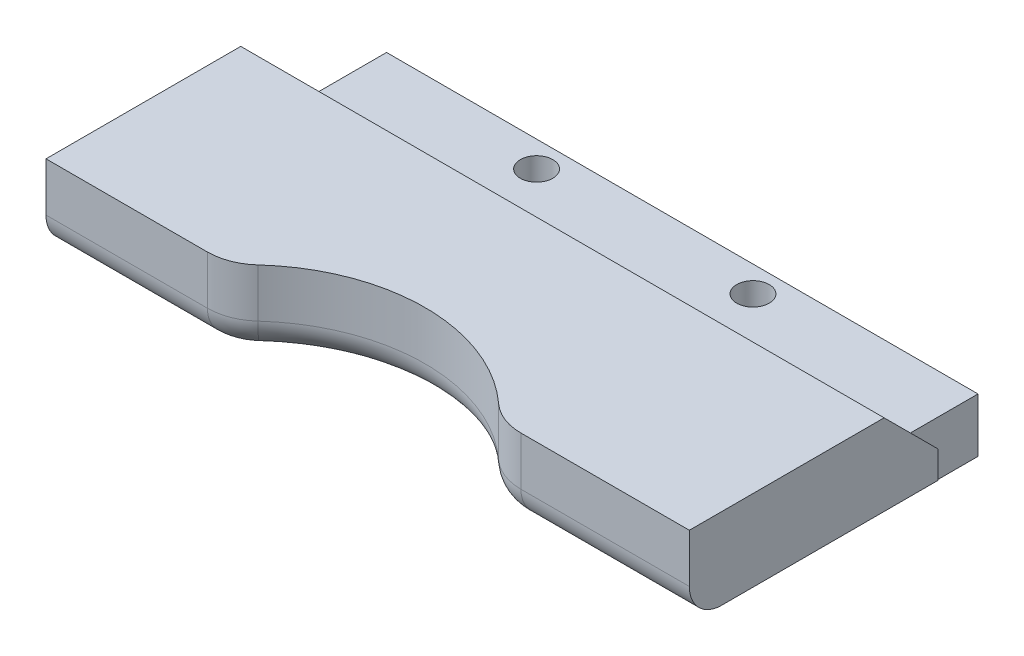
ISO-10303-21;
HEADER;
FILE_DESCRIPTION(('STEP AP214'),'2;1');
FILE_NAME('part.step','',(''),(''),'','','');
FILE_SCHEMA(('AUTOMOTIVE_DESIGN { 1 0 10303 214 1 1 1 1 }'));
ENDSEC;
DATA;
#1=APPLICATION_CONTEXT('core data for automotive mechanical design processes');
#2=APPLICATION_PROTOCOL_DEFINITION('international standard','automotive_design',2000,#1);
#3=PRODUCT_CONTEXT('',#1,'mechanical');
#4=PRODUCT('Part','Part','',(#3));
#5=PRODUCT_RELATED_PRODUCT_CATEGORY('part','',(#4));
#6=PRODUCT_DEFINITION_FORMATION('','',#4);
#7=PRODUCT_DEFINITION_CONTEXT('part definition',#1,'design');
#8=PRODUCT_DEFINITION('design','',#6,#7);
#9=PRODUCT_DEFINITION_SHAPE('','',#8);
#10=(LENGTH_UNIT() NAMED_UNIT(*) SI_UNIT(.MILLI.,.METRE.));
#11=(NAMED_UNIT(*) PLANE_ANGLE_UNIT() SI_UNIT($,.RADIAN.));
#12=(NAMED_UNIT(*) SI_UNIT($,.STERADIAN.) SOLID_ANGLE_UNIT());
#13=UNCERTAINTY_MEASURE_WITH_UNIT(LENGTH_MEASURE(1.E-05),#10,'distance_accuracy_value','');
#14=(GEOMETRIC_REPRESENTATION_CONTEXT(3) GLOBAL_UNCERTAINTY_ASSIGNED_CONTEXT((#13)) GLOBAL_UNIT_ASSIGNED_CONTEXT((#10,
#11,#12)) REPRESENTATION_CONTEXT('',''));
#15=CARTESIAN_POINT('',(0.,0.,0.));
#16=DIRECTION('',(0.,0.,1.));
#17=DIRECTION('',(1.,0.,0.));
#18=AXIS2_PLACEMENT_3D('',#15,#16,#17);
#19=CARTESIAN_POINT('',(0.,0.,11.11));
#20=DIRECTION('',(0.,0.,1.));
#21=DIRECTION('',(1.,0.,0.));
#22=AXIS2_PLACEMENT_3D('',#19,#20,#21);
#23=PLANE('',#22);
#24=DIRECTION('',(0.,-1.,0.));
#25=VECTOR('',#24,1.);
#26=CARTESIAN_POINT('',(-29.7300965377152,3.750174262941,11.11));
#27=LINE('',#26,#25);
#28=CARTESIAN_POINT('',(-29.7300965377152,3.75017426294096,11.11));
#29=VERTEX_POINT('',#28);
#30=CARTESIAN_POINT('',(-29.7300965377152,1.24982573705901,11.11));
#31=VERTEX_POINT('',#30);
#32=EDGE_CURVE('E241',#29,#31,#27,.T.);
#33=ORIENTED_EDGE('',*,*,#32,.F.);
#34=DIRECTION('',(1.,0.,0.));
#35=VECTOR('',#34,1.);
#36=CARTESIAN_POINT('',(29.7300965377152,3.75017426294096,11.11));
#37=LINE('',#36,#35);
#38=CARTESIAN_POINT('',(-26.2566275867251,3.75017426294096,11.11));
#39=VERTEX_POINT('',#38);
#40=EDGE_CURVE('E295',#29,#39,#37,.T.);
#41=ORIENTED_EDGE('',*,*,#40,.T.);
#42=DIRECTION('',(0.,-1.,0.));
#43=VECTOR('',#42,1.);
#44=CARTESIAN_POINT('',(-26.2566275867251,5.,11.11));
#45=LINE('',#44,#43);
#46=CARTESIAN_POINT('',(-26.2566275867251,1.24982573705901,11.11));
#47=VERTEX_POINT('',#46);
#48=EDGE_CURVE('E271',#39,#47,#45,.T.);
#49=ORIENTED_EDGE('',*,*,#48,.T.);
#50=DIRECTION('',(1.,0.,0.));
#51=VECTOR('',#50,1.);
#52=CARTESIAN_POINT('',(-29.7300965377152,1.24982573705901,11.11));
#53=LINE('',#52,#51);
#54=EDGE_CURVE('E237',#31,#47,#53,.T.);
#55=ORIENTED_EDGE('',*,*,#54,.F.);
#56=EDGE_LOOP('',(#33,#41,#49,#55));
#57=FACE_BOUND('',#56,.T.);
#58=ADVANCED_FACE('F72',(#57),#23,.F.);
#59=CARTESIAN_POINT('',(0.,0.,34.11));
#60=DIRECTION('',(0.,0.,1.));
#61=DIRECTION('',(1.,0.,0.));
#62=AXIS2_PLACEMENT_3D('',#59,#60,#61);
#63=PLANE('',#62);
#64=DIRECTION('',(0.,-1.,0.));
#65=VECTOR('',#64,1.);
#66=CARTESIAN_POINT('',(14.1694647091156,1.24982573705901,34.11));
#67=LINE('',#66,#65);
#68=CARTESIAN_POINT('',(14.1694647091156,8.750174262941,34.11));
#69=VERTEX_POINT('',#68);
#70=CARTESIAN_POINT('',(14.1694647091156,4.24982573705901,34.11));
#71=VERTEX_POINT('',#70);
#72=EDGE_CURVE('E327',#69,#71,#67,.T.);
#73=ORIENTED_EDGE('',*,*,#72,.T.);
#74=DIRECTION('',(1.,0.,0.));
#75=VECTOR('',#74,1.);
#76=CARTESIAN_POINT('',(29.7300965377152,4.24982573705901,34.11));
#77=LINE('',#76,#75);
#78=CARTESIAN_POINT('',(29.7300965377152,4.24982573705901,34.11));
#79=VERTEX_POINT('',#78);
#80=EDGE_CURVE('E331',#71,#79,#77,.T.);
#81=ORIENTED_EDGE('',*,*,#80,.T.);
#82=DIRECTION('',(0.,1.,0.));
#83=VECTOR('',#82,1.);
#84=CARTESIAN_POINT('',(29.7300965377152,3.750174262941,34.11));
#85=LINE('',#84,#83);
#86=CARTESIAN_POINT('',(29.7300965377152,8.750174262941,34.11));
#87=VERTEX_POINT('',#86);
#88=EDGE_CURVE('E224',#79,#87,#85,.T.);
#89=ORIENTED_EDGE('',*,*,#88,.T.);
#90=DIRECTION('',(1.,0.,0.));
#91=VECTOR('',#90,1.);
#92=CARTESIAN_POINT('',(12.0810416082533,8.750174262941,34.11));
#93=LINE('',#92,#91);
#94=EDGE_CURVE('E230',#69,#87,#93,.T.);
#95=ORIENTED_EDGE('',*,*,#94,.F.);
#96=EDGE_LOOP('',(#73,#81,#89,#95));
#97=FACE_BOUND('',#96,.T.);
#98=ADVANCED_FACE('F398',(#97),#63,.T.);
#99=CARTESIAN_POINT('',(0.,5.,0.));
#100=DIRECTION('',(0.,-1.,0.));
#101=DIRECTION('',(0.,0.,-1.));
#102=AXIS2_PLACEMENT_3D('',#99,#100,#101);
#103=PLANE('',#102);
#104=CARTESIAN_POINT('',(10.,5.,8.5));
#105=DIRECTION('',(0.,-1.,0.));
#106=DIRECTION('',(0.,0.,-1.));
#107=AXIS2_PLACEMENT_3D('',#104,#105,#106);
#108=CIRCLE('',#107,1.5);
#109=CARTESIAN_POINT('',(10.,5.,7.));
#110=VERTEX_POINT('',#109);
#111=EDGE_CURVE('E251',#110,#110,#108,.T.);
#112=ORIENTED_EDGE('',*,*,#111,.T.);
#113=EDGE_LOOP('',(#112));
#114=FACE_BOUND('',#113,.T.);
#115=DIRECTION('',(0.,0.,1.));
#116=VECTOR('',#115,1.);
#117=CARTESIAN_POINT('',(-26.2566275867251,5.,6.11));
#118=LINE('',#117,#116);
#119=CARTESIAN_POINT('',(-26.2566275867251,5.,6.11));
#120=VERTEX_POINT('',#119);
#121=CARTESIAN_POINT('',(-26.2566275867251,5.,12.3598257370591));
#122=VERTEX_POINT('',#121);
#123=EDGE_CURVE('E269',#120,#122,#118,.T.);
#124=ORIENTED_EDGE('',*,*,#123,.T.);
#125=DIRECTION('',(1.,0.,0.));
#126=VECTOR('',#125,1.);
#127=CARTESIAN_POINT('',(0.,5.,12.359825737059));
#128=LINE('',#127,#126);
#129=CARTESIAN_POINT('',(28.4076907050134,5.,12.3598257370591));
#130=VERTEX_POINT('',#129);
#131=EDGE_CURVE('E302',#122,#130,#128,.T.);
#132=ORIENTED_EDGE('',*,*,#131,.T.);
#133=DIRECTION('',(0.,0.,1.));
#134=VECTOR('',#133,1.);
#135=CARTESIAN_POINT('',(28.4076907050134,5.,6.11));
#136=LINE('',#135,#134);
#137=CARTESIAN_POINT('',(28.4076907050134,5.,6.11));
#138=VERTEX_POINT('',#137);
#139=EDGE_CURVE('E263',#138,#130,#136,.T.);
#140=ORIENTED_EDGE('',*,*,#139,.F.);
#141=DIRECTION('',(1.,0.,0.));
#142=VECTOR('',#141,1.);
#143=CARTESIAN_POINT('',(-26.2566275867251,5.,6.11));
#144=LINE('',#143,#142);
#145=EDGE_CURVE('E265',#120,#138,#144,.T.);
#146=ORIENTED_EDGE('',*,*,#145,.F.);
#147=EDGE_LOOP('',(#124,#132,#140,#146));
#148=FACE_BOUND('',#147,.T.);
#149=CARTESIAN_POINT('',(-10.,5.,8.5));
#150=DIRECTION('',(0.,1.,0.));
#151=DIRECTION('',(0.,0.,1.));
#152=AXIS2_PLACEMENT_3D('',#149,#150,#151);
#153=CIRCLE('',#152,1.5);
#154=CARTESIAN_POINT('',(-10.,5.,10.));
#155=VERTEX_POINT('',#154);
#156=EDGE_CURVE('E257',#155,#155,#153,.T.);
#157=ORIENTED_EDGE('',*,*,#156,.F.);
#158=EDGE_LOOP('',(#157));
#159=FACE_BOUND('',#158,.T.);
#160=ADVANCED_FACE('F427',(#114,#148,#159),#103,.F.);
#161=CARTESIAN_POINT('',(0.,0.,0.));
#162=DIRECTION('',(0.,-1.,0.));
#163=DIRECTION('',(0.,0.,-1.));
#164=AXIS2_PLACEMENT_3D('',#161,#162,#163);
#165=PLANE('',#164);
#166=CARTESIAN_POINT('',(10.,0.,8.5));
#167=DIRECTION('',(0.,-1.,0.));
#168=DIRECTION('',(0.,0.,-1.));
#169=AXIS2_PLACEMENT_3D('',#166,#167,#168);
#170=CIRCLE('',#169,1.5);
#171=CARTESIAN_POINT('',(10.,0.,7.));
#172=VERTEX_POINT('',#171);
#173=EDGE_CURVE('E250',#172,#172,#170,.T.);
#174=ORIENTED_EDGE('',*,*,#173,.F.);
#175=EDGE_LOOP('',(#174));
#176=FACE_BOUND('',#175,.T.);
#177=DIRECTION('',(1.,0.,0.));
#178=VECTOR('',#177,1.);
#179=CARTESIAN_POINT('',(-26.2566275867251,0.,11.11));
#180=LINE('',#179,#178);
#181=CARTESIAN_POINT('',(-26.2566275867251,0.,11.11));
#182=VERTEX_POINT('',#181);
#183=CARTESIAN_POINT('',(28.4076907050134,0.,11.11));
#184=VERTEX_POINT('',#183);
#185=EDGE_CURVE('E260',#182,#184,#180,.T.);
#186=ORIENTED_EDGE('',*,*,#185,.F.);
#187=DIRECTION('',(0.,0.,1.));
#188=VECTOR('',#187,1.);
#189=CARTESIAN_POINT('',(-26.2566275867251,0.,6.11));
#190=LINE('',#189,#188);
#191=CARTESIAN_POINT('',(-26.2566275867251,0.,6.11));
#192=VERTEX_POINT('',#191);
#193=EDGE_CURVE('E266',#192,#182,#190,.T.);
#194=ORIENTED_EDGE('',*,*,#193,.F.);
#195=DIRECTION('',(1.,0.,0.));
#196=VECTOR('',#195,1.);
#197=CARTESIAN_POINT('',(-26.2566275867251,0.,6.11));
#198=LINE('',#197,#196);
#199=CARTESIAN_POINT('',(28.4076907050134,0.,6.11));
#200=VERTEX_POINT('',#199);
#201=EDGE_CURVE('E277',#192,#200,#198,.T.);
#202=ORIENTED_EDGE('',*,*,#201,.T.);
#203=DIRECTION('',(0.,0.,1.));
#204=VECTOR('',#203,1.);
#205=CARTESIAN_POINT('',(28.4076907050134,0.,6.11));
#206=LINE('',#205,#204);
#207=EDGE_CURVE('E274',#200,#184,#206,.T.);
#208=ORIENTED_EDGE('',*,*,#207,.T.);
#209=EDGE_LOOP('',(#186,#194,#202,#208));
#210=FACE_BOUND('',#209,.T.);
#211=CARTESIAN_POINT('',(-10.,0.,8.5));
#212=DIRECTION('',(0.,1.,0.));
#213=DIRECTION('',(0.,0.,1.));
#214=AXIS2_PLACEMENT_3D('',#211,#212,#213);
#215=CIRCLE('',#214,1.5);
#216=CARTESIAN_POINT('',(-10.,0.,10.));
#217=VERTEX_POINT('',#216);
#218=EDGE_CURVE('E254',#217,#217,#215,.T.);
#219=ORIENTED_EDGE('',*,*,#218,.T.);
#220=EDGE_LOOP('',(#219));
#221=FACE_BOUND('',#220,.T.);
#222=ADVANCED_FACE('F461',(#176,#210,#221),#165,.T.);
#223=CARTESIAN_POINT('',(28.4076907050134,5.,6.11));
#224=DIRECTION('',(1.,0.,0.));
#225=DIRECTION('',(0.,0.,-1.));
#226=AXIS2_PLACEMENT_3D('',#223,#224,#225);
#227=PLANE('',#226);
#228=ORIENTED_EDGE('',*,*,#207,.F.);
#229=DIRECTION('',(0.,-1.,0.));
#230=VECTOR('',#229,1.);
#231=CARTESIAN_POINT('',(28.4076907050134,5.,6.11));
#232=LINE('',#231,#230);
#233=EDGE_CURVE('E285',#138,#200,#232,.T.);
#234=ORIENTED_EDGE('',*,*,#233,.F.);
#235=ORIENTED_EDGE('',*,*,#139,.T.);
#236=DIRECTION('',(0.,-0.707106781186544,-0.707106781186551));
#237=VECTOR('',#236,1.);
#238=CARTESIAN_POINT('',(28.4076907050134,8.75017426294101,16.1100000000001));
#239=LINE('',#238,#237);
#240=CARTESIAN_POINT('',(28.4076907050134,3.75017426294096,11.11));
#241=VERTEX_POINT('',#240);
#242=EDGE_CURVE('E305',#130,#241,#239,.T.);
#243=ORIENTED_EDGE('',*,*,#242,.T.);
#244=DIRECTION('',(0.,-1.,0.));
#245=VECTOR('',#244,1.);
#246=CARTESIAN_POINT('',(28.4076907050134,5.,11.11));
#247=LINE('',#246,#245);
#248=CARTESIAN_POINT('',(28.4076907050134,1.24982573705901,11.11));
#249=VERTEX_POINT('',#248);
#250=EDGE_CURVE('E287',#241,#249,#247,.T.);
#251=ORIENTED_EDGE('',*,*,#250,.T.);
#252=DIRECTION('',(0.,0.,-1.));
#253=VECTOR('',#252,1.);
#254=CARTESIAN_POINT('',(28.4076907050134,1.24982573705901,34.11));
#255=LINE('',#254,#253);
#256=CARTESIAN_POINT('',(28.4076907050134,1.24982573705901,15.9509142078914));
#257=VERTEX_POINT('',#256);
#258=EDGE_CURVE('E313',#257,#249,#255,.T.);
#259=ORIENTED_EDGE('',*,*,#258,.F.);
#260=CARTESIAN_POINT('',(28.4076907050134,-8.75017426294099,15.9509142078914));
#261=DIRECTION('',(1.,0.,0.));
#262=DIRECTION('',(0.,0.,-1.));
#263=AXIS2_PLACEMENT_3D('',#260,#261,#262);
#264=CIRCLE('',#263,10.);
#265=EDGE_CURVE('E315',#257,#184,#264,.F.);
#266=ORIENTED_EDGE('',*,*,#265,.T.);
#267=EDGE_LOOP('',(#228,#234,#235,#243,#251,#259,#266));
#268=FACE_BOUND('',#267,.T.);
#269=ADVANCED_FACE('F447',(#268),#227,.T.);
#270=CARTESIAN_POINT('',(-26.2566275867251,5.,6.11));
#271=DIRECTION('',(0.,0.,-1.));
#272=DIRECTION('',(-1.,0.,0.));
#273=AXIS2_PLACEMENT_3D('',#270,#271,#272);
#274=PLANE('',#273);
#275=ORIENTED_EDGE('',*,*,#201,.F.);
#276=DIRECTION('',(0.,-1.,0.));
#277=VECTOR('',#276,1.);
#278=CARTESIAN_POINT('',(-26.2566275867251,5.,6.11));
#279=LINE('',#278,#277);
#280=EDGE_CURVE('E283',#120,#192,#279,.T.);
#281=ORIENTED_EDGE('',*,*,#280,.F.);
#282=ORIENTED_EDGE('',*,*,#145,.T.);
#283=ORIENTED_EDGE('',*,*,#233,.T.);
#284=EDGE_LOOP('',(#275,#281,#282,#283));
#285=FACE_BOUND('',#284,.T.);
#286=ADVANCED_FACE('F465',(#285),#274,.T.);
#287=CARTESIAN_POINT('',(-26.2566275867251,5.,6.11));
#288=DIRECTION('',(1.,0.,0.));
#289=DIRECTION('',(0.,0.,-1.));
#290=AXIS2_PLACEMENT_3D('',#287,#288,#289);
#291=PLANE('',#290);
#292=ORIENTED_EDGE('',*,*,#193,.T.);
#293=CARTESIAN_POINT('',(-26.2566275867251,-8.75017426294099,15.9509142078914));
#294=DIRECTION('',(1.,0.,0.));
#295=DIRECTION('',(0.,0.,-1.));
#296=AXIS2_PLACEMENT_3D('',#293,#294,#295);
#297=CIRCLE('',#296,10.);
#298=CARTESIAN_POINT('',(-26.2566275867251,1.24982573705901,15.9509142078914));
#299=VERTEX_POINT('',#298);
#300=EDGE_CURVE('E317',#182,#299,#297,.T.);
#301=ORIENTED_EDGE('',*,*,#300,.T.);
#302=DIRECTION('',(0.,0.,1.));
#303=VECTOR('',#302,1.);
#304=CARTESIAN_POINT('',(-26.2566275867251,1.24982573705901,6.11));
#305=LINE('',#304,#303);
#306=EDGE_CURVE('E307',#47,#299,#305,.T.);
#307=ORIENTED_EDGE('',*,*,#306,.F.);
#308=ORIENTED_EDGE('',*,*,#48,.F.);
#309=DIRECTION('',(0.,0.707106781186544,0.707106781186551));
#310=VECTOR('',#309,1.);
#311=CARTESIAN_POINT('',(-26.2566275867251,1.87508713147048,9.23491286852949));
#312=LINE('',#311,#310);
#313=EDGE_CURVE('E299',#39,#122,#312,.T.);
#314=ORIENTED_EDGE('',*,*,#313,.T.);
#315=ORIENTED_EDGE('',*,*,#123,.F.);
#316=ORIENTED_EDGE('',*,*,#280,.T.);
#317=EDGE_LOOP('',(#292,#301,#307,#308,#314,#315,#316));
#318=FACE_BOUND('',#317,.T.);
#319=ADVANCED_FACE('F454',(#318),#291,.F.);
#320=CARTESIAN_POINT('',(-10.,5.,8.5));
#321=DIRECTION('',(0.,-1.,0.));
#322=DIRECTION('',(0.,0.,-1.));
#323=AXIS2_PLACEMENT_3D('',#320,#321,#322);
#324=CYLINDRICAL_SURFACE('',#323,1.5);
#325=ORIENTED_EDGE('',*,*,#156,.T.);
#326=EDGE_LOOP('',(#325));
#327=FACE_BOUND('',#326,.T.);
#328=ORIENTED_EDGE('',*,*,#218,.F.);
#329=EDGE_LOOP('',(#328));
#330=FACE_BOUND('',#329,.T.);
#331=ADVANCED_FACE('F438',(#327,#330),#324,.F.);
#332=CARTESIAN_POINT('',(10.,5.,8.5));
#333=DIRECTION('',(0.,-1.,0.));
#334=DIRECTION('',(0.,0.,-1.));
#335=AXIS2_PLACEMENT_3D('',#332,#333,#334);
#336=CYLINDRICAL_SURFACE('',#335,1.5);
#337=ORIENTED_EDGE('',*,*,#111,.F.);
#338=EDGE_LOOP('',(#337));
#339=FACE_BOUND('',#338,.T.);
#340=ORIENTED_EDGE('',*,*,#173,.T.);
#341=EDGE_LOOP('',(#340));
#342=FACE_BOUND('',#341,.T.);
#343=ADVANCED_FACE('F431',(#339,#342),#336,.F.);
#344=ORIENTED_EDGE('',*,*,#250,.F.);
#345=DIRECTION('',(1.,0.,0.));
#346=VECTOR('',#345,1.);
#347=CARTESIAN_POINT('',(29.7300965377152,3.75017426294096,11.11));
#348=LINE('',#347,#346);
#349=CARTESIAN_POINT('',(29.7300965377152,3.75017426294096,11.11));
#350=VERTEX_POINT('',#349);
#351=EDGE_CURVE('E293',#241,#350,#348,.T.);
#352=ORIENTED_EDGE('',*,*,#351,.T.);
#353=DIRECTION('',(0.,1.,0.));
#354=VECTOR('',#353,1.);
#355=CARTESIAN_POINT('',(29.7300965377152,3.750174262941,11.11));
#356=LINE('',#355,#354);
#357=CARTESIAN_POINT('',(29.7300965377152,1.24982573705901,11.11));
#358=VERTEX_POINT('',#357);
#359=EDGE_CURVE('E236',#358,#350,#356,.T.);
#360=ORIENTED_EDGE('',*,*,#359,.F.);
#361=EDGE_CURVE('E244',#249,#358,#53,.T.);
#362=ORIENTED_EDGE('',*,*,#361,.F.);
#363=EDGE_LOOP('',(#344,#352,#360,#362));
#364=FACE_BOUND('',#363,.T.);
#365=ADVANCED_FACE('F423',(#364),#23,.F.);
#366=CARTESIAN_POINT('',(29.7300965377152,3.750174262941,34.11));
#367=DIRECTION('',(-1.,0.,0.));
#368=DIRECTION('',(0.,0.,1.));
#369=AXIS2_PLACEMENT_3D('',#366,#367,#368);
#370=PLANE('',#369);
#371=ORIENTED_EDGE('',*,*,#88,.F.);
#372=CARTESIAN_POINT('',(29.7300965377152,4.24982573705901,31.11));
#373=DIRECTION('',(-1.,0.,0.));
#374=DIRECTION('',(0.,0.,1.));
#375=AXIS2_PLACEMENT_3D('',#372,#373,#374);
#376=CIRCLE('',#375,3.);
#377=CARTESIAN_POINT('',(29.7300965377152,1.24982573705901,31.11));
#378=VERTEX_POINT('',#377);
#379=EDGE_CURVE('E334',#79,#378,#376,.F.);
#380=ORIENTED_EDGE('',*,*,#379,.T.);
#381=DIRECTION('',(0.,0.,-1.));
#382=VECTOR('',#381,1.);
#383=CARTESIAN_POINT('',(29.7300965377152,1.24982573705901,34.11));
#384=LINE('',#383,#382);
#385=EDGE_CURVE('E223',#378,#358,#384,.T.);
#386=ORIENTED_EDGE('',*,*,#385,.T.);
#387=ORIENTED_EDGE('',*,*,#359,.T.);
#388=DIRECTION('',(0.,0.707106781186544,0.707106781186551));
#389=VECTOR('',#388,1.);
#390=CARTESIAN_POINT('',(29.7300965377152,8.750174262941,16.1100000000001));
#391=LINE('',#390,#389);
#392=CARTESIAN_POINT('',(29.7300965377152,8.750174262941,16.1100000000001));
#393=VERTEX_POINT('',#392);
#394=EDGE_CURVE('E297',#350,#393,#391,.T.);
#395=ORIENTED_EDGE('',*,*,#394,.T.);
#396=DIRECTION('',(0.,0.,-1.));
#397=VECTOR('',#396,1.);
#398=CARTESIAN_POINT('',(29.7300965377152,8.750174262941,34.11));
#399=LINE('',#398,#397);
#400=EDGE_CURVE('E217',#87,#393,#399,.T.);
#401=ORIENTED_EDGE('',*,*,#400,.F.);
#402=EDGE_LOOP('',(#371,#380,#386,#387,#395,#401));
#403=FACE_BOUND('',#402,.T.);
#404=ADVANCED_FACE('F401',(#403),#370,.F.);
#405=CARTESIAN_POINT('',(-29.7300965377152,3.750174262941,34.11));
#406=DIRECTION('',(1.,0.,0.));
#407=DIRECTION('',(0.,0.,-1.));
#408=AXIS2_PLACEMENT_3D('',#405,#406,#407);
#409=PLANE('',#408);
#410=DIRECTION('',(0.,0.,-1.));
#411=VECTOR('',#410,1.);
#412=CARTESIAN_POINT('',(-29.7300965377152,1.24982573705901,34.11));
#413=LINE('',#412,#411);
#414=CARTESIAN_POINT('',(-29.7300965377152,1.24982573705901,31.11));
#415=VERTEX_POINT('',#414);
#416=EDGE_CURVE('E248',#415,#31,#413,.T.);
#417=ORIENTED_EDGE('',*,*,#416,.F.);
#418=CARTESIAN_POINT('',(-29.7300965377152,4.24982573705901,31.11));
#419=DIRECTION('',(1.,0.,0.));
#420=DIRECTION('',(0.,0.,-1.));
#421=AXIS2_PLACEMENT_3D('',#418,#419,#420);
#422=CIRCLE('',#421,3.);
#423=CARTESIAN_POINT('',(-29.7300965377152,4.24982573705901,34.11));
#424=VERTEX_POINT('',#423);
#425=EDGE_CURVE('E96',#415,#424,#422,.F.);
#426=ORIENTED_EDGE('',*,*,#425,.T.);
#427=DIRECTION('',(0.,-1.,0.));
#428=VECTOR('',#427,1.);
#429=CARTESIAN_POINT('',(-29.7300965377152,3.750174262941,34.11));
#430=LINE('',#429,#428);
#431=CARTESIAN_POINT('',(-29.7300965377152,8.750174262941,34.11));
#432=VERTEX_POINT('',#431);
#433=EDGE_CURVE('E219',#432,#424,#430,.T.);
#434=ORIENTED_EDGE('',*,*,#433,.F.);
#435=DIRECTION('',(0.,0.,1.));
#436=VECTOR('',#435,1.);
#437=CARTESIAN_POINT('',(-29.7300965377152,8.750174262941,11.11));
#438=LINE('',#437,#436);
#439=CARTESIAN_POINT('',(-29.7300965377152,8.750174262941,16.1100000000001));
#440=VERTEX_POINT('',#439);
#441=EDGE_CURVE('E208',#440,#432,#438,.T.);
#442=ORIENTED_EDGE('',*,*,#441,.F.);
#443=DIRECTION('',(0.,-0.707106781186544,-0.707106781186551));
#444=VECTOR('',#443,1.);
#445=CARTESIAN_POINT('',(-29.7300965377152,8.750174262941,16.1100000000001));
#446=LINE('',#445,#444);
#447=EDGE_CURVE('E291',#440,#29,#446,.T.);
#448=ORIENTED_EDGE('',*,*,#447,.T.);
#449=ORIENTED_EDGE('',*,*,#32,.T.);
#450=EDGE_LOOP('',(#417,#426,#434,#442,#448,#449));
#451=FACE_BOUND('',#450,.T.);
#452=ADVANCED_FACE('F220',(#451),#409,.F.);
#453=CARTESIAN_POINT('',(-29.7300965377152,1.24982573705901,34.11));
#454=DIRECTION('',(0.,1.,0.));
#455=DIRECTION('',(0.,0.,1.));
#456=AXIS2_PLACEMENT_3D('',#453,#454,#455);
#457=PLANE('',#456);
#458=ORIENTED_EDGE('',*,*,#385,.F.);
#459=DIRECTION('',(1.,0.,0.));
#460=VECTOR('',#459,1.);
#461=CARTESIAN_POINT('',(14.1694647091156,1.24982573705901,31.11));
#462=LINE('',#461,#460);
#463=CARTESIAN_POINT('',(14.1694647091156,1.24982573705901,31.11));
#464=VERTEX_POINT('',#463);
#465=EDGE_CURVE('E344',#378,#464,#462,.F.);
#466=ORIENTED_EDGE('',*,*,#465,.T.);
#467=CARTESIAN_POINT('',(14.1694647091156,1.24982573705901,29.11));
#468=DIRECTION('',(0.,1.,0.));
#469=DIRECTION('',(0.,0.,1.));
#470=AXIS2_PLACEMENT_3D('',#467,#468,#469);
#471=CIRCLE('',#470,2.);
#472=CARTESIAN_POINT('',(12.8216075268723,1.24982573705901,30.5875929805853));
#473=VERTEX_POINT('',#472);
#474=EDGE_CURVE('E342',#464,#473,#471,.F.);
#475=ORIENTED_EDGE('',*,*,#474,.T.);
#476=CARTESIAN_POINT('',(-0.320000000000778,1.24982573705901,44.9941245412918));
#477=DIRECTION('',(0.,1.,0.));
#478=DIRECTION('',(0.,0.,1.));
#479=AXIS2_PLACEMENT_3D('',#476,#477,#478);
#480=CIRCLE('',#479,19.5);
#481=CARTESIAN_POINT('',(-13.4616075268738,1.24982573705901,30.5875929805853));
#482=VERTEX_POINT('',#481);
#483=EDGE_CURVE('E336',#473,#482,#480,.T.);
#484=ORIENTED_EDGE('',*,*,#483,.T.);
#485=CARTESIAN_POINT('',(-14.8094647091172,1.24982573705901,29.11));
#486=DIRECTION('',(0.,1.,0.));
#487=DIRECTION('',(0.,0.,1.));
#488=AXIS2_PLACEMENT_3D('',#485,#486,#487);
#489=CIRCLE('',#488,2.);
#490=CARTESIAN_POINT('',(-14.8094647091172,1.24982573705901,31.11));
#491=VERTEX_POINT('',#490);
#492=EDGE_CURVE('E338',#482,#491,#489,.F.);
#493=ORIENTED_EDGE('',*,*,#492,.T.);
#494=DIRECTION('',(1.,0.,0.));
#495=VECTOR('',#494,1.);
#496=CARTESIAN_POINT('',(-29.7300965377152,1.24982573705901,31.11));
#497=LINE('',#496,#495);
#498=EDGE_CURVE('E340',#491,#415,#497,.F.);
#499=ORIENTED_EDGE('',*,*,#498,.T.);
#500=ORIENTED_EDGE('',*,*,#416,.T.);
#501=ORIENTED_EDGE('',*,*,#54,.T.);
#502=ORIENTED_EDGE('',*,*,#306,.T.);
#503=DIRECTION('',(-1.,0.,0.));
#504=VECTOR('',#503,1.);
#505=CARTESIAN_POINT('',(-29.7300965377152,1.24982573705901,15.9509142078914));
#506=LINE('',#505,#504);
#507=EDGE_CURVE('E310',#299,#257,#506,.F.);
#508=ORIENTED_EDGE('',*,*,#507,.T.);
#509=ORIENTED_EDGE('',*,*,#258,.T.);
#510=ORIENTED_EDGE('',*,*,#361,.T.);
#511=EDGE_LOOP('',(#458,#466,#475,#484,#493,#499,#500,#501,#502,#508,#509,#510));
#512=FACE_BOUND('',#511,.T.);
#513=ADVANCED_FACE('F383',(#512),#457,.F.);
#514=ORIENTED_EDGE('',*,*,#433,.T.);
#515=DIRECTION('',(1.,0.,0.));
#516=VECTOR('',#515,1.);
#517=CARTESIAN_POINT('',(-14.8094647091172,4.24982573705901,34.11));
#518=LINE('',#517,#516);
#519=CARTESIAN_POINT('',(-14.8094647091172,4.24982573705901,34.11));
#520=VERTEX_POINT('',#519);
#521=EDGE_CURVE('E348',#424,#520,#518,.T.);
#522=ORIENTED_EDGE('',*,*,#521,.T.);
#523=DIRECTION('',(0.,-1.,0.));
#524=VECTOR('',#523,1.);
#525=CARTESIAN_POINT('',(-14.8094647091172,8.750174262941,34.11));
#526=LINE('',#525,#524);
#527=CARTESIAN_POINT('',(-14.8094647091172,8.750174262941,34.11));
#528=VERTEX_POINT('',#527);
#529=EDGE_CURVE('E227',#520,#528,#526,.F.);
#530=ORIENTED_EDGE('',*,*,#529,.T.);
#531=DIRECTION('',(1.,0.,0.));
#532=VECTOR('',#531,1.);
#533=CARTESIAN_POINT('',(-29.7300965377152,8.750174262941,34.11));
#534=LINE('',#533,#532);
#535=EDGE_CURVE('E212',#432,#528,#534,.T.);
#536=ORIENTED_EDGE('',*,*,#535,.F.);
#537=EDGE_LOOP('',(#514,#522,#530,#536));
#538=FACE_BOUND('',#537,.T.);
#539=ADVANCED_FACE('F226',(#538),#63,.T.);
#540=CARTESIAN_POINT('',(-0.320000000000778,-11.249825737059,44.9941245412918));
#541=DIRECTION('',(0.,1.,0.));
#542=DIRECTION('',(0.,0.,1.));
#543=AXIS2_PLACEMENT_3D('',#540,#541,#542);
#544=CYLINDRICAL_SURFACE('',#543,16.5);
#545=DIRECTION('',(0.,1.,0.));
#546=VECTOR('',#545,1.);
#547=CARTESIAN_POINT('',(-11.4398217535087,-11.249825737059,32.8039824514632));
#548=LINE('',#547,#546);
#549=CARTESIAN_POINT('',(-11.4398217535087,8.750174262941,32.8039824514632));
#550=VERTEX_POINT('',#549);
#551=CARTESIAN_POINT('',(-11.4398217535087,4.24982573705901,32.8039824514632));
#552=VERTEX_POINT('',#551);
#553=EDGE_CURVE('E319',#550,#552,#548,.F.);
#554=ORIENTED_EDGE('',*,*,#553,.T.);
#555=CARTESIAN_POINT('',(-0.320000000000778,4.24982573705901,44.9941245412918));
#556=DIRECTION('',(0.,1.,0.));
#557=DIRECTION('',(0.,0.,1.));
#558=AXIS2_PLACEMENT_3D('',#555,#556,#557);
#559=CIRCLE('',#558,16.5);
#560=CARTESIAN_POINT('',(10.7998217535072,4.24982573705901,32.8039824514632));
#561=VERTEX_POINT('',#560);
#562=EDGE_CURVE('E12',#552,#561,#559,.F.);
#563=ORIENTED_EDGE('',*,*,#562,.T.);
#564=DIRECTION('',(0.,1.,0.));
#565=VECTOR('',#564,1.);
#566=CARTESIAN_POINT('',(10.7998217535072,-11.249825737059,32.8039824514632));
#567=LINE('',#566,#565);
#568=CARTESIAN_POINT('',(10.7998217535072,8.750174262941,32.8039824514632));
#569=VERTEX_POINT('',#568);
#570=EDGE_CURVE('E321',#561,#569,#567,.T.);
#571=ORIENTED_EDGE('',*,*,#570,.T.);
#572=CARTESIAN_POINT('',(-0.320000000000778,8.750174262941,44.9941245412918));
#573=DIRECTION('',(0.,-1.,0.));
#574=DIRECTION('',(0.,0.,1.));
#575=AXIS2_PLACEMENT_3D('',#572,#573,#574);
#576=CIRCLE('',#575,16.5);
#577=EDGE_CURVE('E228',#550,#569,#576,.T.);
#578=ORIENTED_EDGE('',*,*,#577,.F.);
#579=EDGE_LOOP('',(#554,#563,#571,#578));
#580=FACE_BOUND('',#579,.T.);
#581=ADVANCED_FACE('F390',(#580),#544,.F.);
#582=CARTESIAN_POINT('',(-0.320000000000778,8.750174262941,44.9941245412918));
#583=DIRECTION('',(0.,1.,0.));
#584=DIRECTION('',(0.,0.,1.));
#585=AXIS2_PLACEMENT_3D('',#582,#583,#584);
#586=PLANE('',#585);
#587=ORIENTED_EDGE('',*,*,#577,.T.);
#588=CARTESIAN_POINT('',(14.1694647091156,8.750174262941,29.11));
#589=DIRECTION('',(0.,1.,0.));
#590=DIRECTION('',(0.,0.,1.));
#591=AXIS2_PLACEMENT_3D('',#588,#589,#590);
#592=CIRCLE('',#591,5.);
#593=EDGE_CURVE('E325',#569,#69,#592,.T.);
#594=ORIENTED_EDGE('',*,*,#593,.T.);
#595=ORIENTED_EDGE('',*,*,#94,.T.);
#596=ORIENTED_EDGE('',*,*,#400,.T.);
#597=DIRECTION('',(-1.,0.,0.));
#598=VECTOR('',#597,1.);
#599=CARTESIAN_POINT('',(-29.7300965377152,8.750174262941,16.1100000000001));
#600=LINE('',#599,#598);
#601=EDGE_CURVE('E216',#393,#440,#600,.T.);
#602=ORIENTED_EDGE('',*,*,#601,.T.);
#603=ORIENTED_EDGE('',*,*,#441,.T.);
#604=ORIENTED_EDGE('',*,*,#535,.T.);
#605=CARTESIAN_POINT('',(-14.8094647091172,8.750174262941,29.11));
#606=DIRECTION('',(0.,1.,0.));
#607=DIRECTION('',(0.,0.,1.));
#608=AXIS2_PLACEMENT_3D('',#605,#606,#607);
#609=CIRCLE('',#608,5.);
#610=EDGE_CURVE('E323',#528,#550,#609,.T.);
#611=ORIENTED_EDGE('',*,*,#610,.T.);
#612=EDGE_LOOP('',(#587,#594,#595,#596,#602,#603,#604,#611));
#613=FACE_BOUND('',#612,.T.);
#614=ADVANCED_FACE('F210',(#613),#586,.T.);
#615=CARTESIAN_POINT('',(-0.320000000000778,8.750174262941,16.1100000000001));
#616=DIRECTION('',(0.,0.707106781186551,-0.707106781186544));
#617=DIRECTION('',(1.,0.,0.));
#618=AXIS2_PLACEMENT_3D('',#615,#616,#617);
#619=PLANE('',#618);
#620=ORIENTED_EDGE('',*,*,#313,.F.);
#621=ORIENTED_EDGE('',*,*,#40,.F.);
#622=ORIENTED_EDGE('',*,*,#447,.F.);
#623=ORIENTED_EDGE('',*,*,#601,.F.);
#624=ORIENTED_EDGE('',*,*,#394,.F.);
#625=ORIENTED_EDGE('',*,*,#351,.F.);
#626=ORIENTED_EDGE('',*,*,#242,.F.);
#627=ORIENTED_EDGE('',*,*,#131,.F.);
#628=EDGE_LOOP('',(#620,#621,#622,#623,#624,#625,#626,#627));
#629=FACE_BOUND('',#628,.T.);
#630=ADVANCED_FACE('F374',(#629),#619,.T.);
#631=CARTESIAN_POINT('',(-26.2566275867251,-8.75017426294099,15.9509142078914));
#632=DIRECTION('',(-1.,0.,0.));
#633=DIRECTION('',(0.,0.,1.));
#634=AXIS2_PLACEMENT_3D('',#631,#632,#633);
#635=CYLINDRICAL_SURFACE('',#634,10.);
#636=ORIENTED_EDGE('',*,*,#300,.F.);
#637=ORIENTED_EDGE('',*,*,#185,.T.);
#638=ORIENTED_EDGE('',*,*,#265,.F.);
#639=ORIENTED_EDGE('',*,*,#507,.F.);
#640=EDGE_LOOP('',(#636,#637,#638,#639));
#641=FACE_BOUND('',#640,.T.);
#642=ADVANCED_FACE('F459',(#641),#635,.F.);
#643=CARTESIAN_POINT('',(14.1694647091156,-11.249825737059,29.11));
#644=DIRECTION('',(0.,1.,0.));
#645=DIRECTION('',(0.,0.,1.));
#646=AXIS2_PLACEMENT_3D('',#643,#644,#645);
#647=CYLINDRICAL_SURFACE('',#646,5.);
#648=ORIENTED_EDGE('',*,*,#570,.F.);
#649=CARTESIAN_POINT('',(14.1694647091156,4.24982573705901,29.11));
#650=DIRECTION('',(0.,1.,0.));
#651=DIRECTION('',(0.,0.,1.));
#652=AXIS2_PLACEMENT_3D('',#649,#650,#651);
#653=CIRCLE('',#652,5.);
#654=EDGE_CURVE('E346',#561,#71,#653,.T.);
#655=ORIENTED_EDGE('',*,*,#654,.T.);
#656=ORIENTED_EDGE('',*,*,#72,.F.);
#657=ORIENTED_EDGE('',*,*,#593,.F.);
#658=EDGE_LOOP('',(#648,#655,#656,#657));
#659=FACE_BOUND('',#658,.T.);
#660=ADVANCED_FACE('F396',(#659),#647,.T.);
#661=CARTESIAN_POINT('',(-14.8094647091172,-11.249825737059,29.11));
#662=DIRECTION('',(0.,1.,0.));
#663=DIRECTION('',(0.,0.,1.));
#664=AXIS2_PLACEMENT_3D('',#661,#662,#663);
#665=CYLINDRICAL_SURFACE('',#664,5.);
#666=ORIENTED_EDGE('',*,*,#529,.F.);
#667=CARTESIAN_POINT('',(-14.8094647091172,4.24982573705901,29.11));
#668=DIRECTION('',(0.,1.,0.));
#669=DIRECTION('',(0.,0.,1.));
#670=AXIS2_PLACEMENT_3D('',#667,#668,#669);
#671=CIRCLE('',#670,5.);
#672=EDGE_CURVE('E81',#520,#552,#671,.T.);
#673=ORIENTED_EDGE('',*,*,#672,.T.);
#674=ORIENTED_EDGE('',*,*,#553,.F.);
#675=ORIENTED_EDGE('',*,*,#610,.F.);
#676=EDGE_LOOP('',(#666,#673,#674,#675));
#677=FACE_BOUND('',#676,.T.);
#678=ADVANCED_FACE('F387',(#677),#665,.T.);
#679=CARTESIAN_POINT('',(0.,4.24982573705901,31.11));
#680=DIRECTION('',(-1.,0.,0.));
#681=DIRECTION('',(0.,0.,1.));
#682=AXIS2_PLACEMENT_3D('',#679,#680,#681);
#683=CYLINDRICAL_SURFACE('',#682,3.);
#684=ORIENTED_EDGE('',*,*,#425,.F.);
#685=ORIENTED_EDGE('',*,*,#498,.F.);
#686=CARTESIAN_POINT('',(-14.8094647091172,4.24982573705901,31.11));
#687=DIRECTION('',(1.,0.,0.));
#688=DIRECTION('',(0.,0.,-1.));
#689=AXIS2_PLACEMENT_3D('',#686,#687,#688);
#690=CIRCLE('',#689,3.);
#691=EDGE_CURVE('E76',#520,#491,#690,.T.);
#692=ORIENTED_EDGE('',*,*,#691,.F.);
#693=ORIENTED_EDGE('',*,*,#521,.F.);
#694=EDGE_LOOP('',(#684,#685,#692,#693));
#695=FACE_BOUND('',#694,.T.);
#696=ADVANCED_FACE('F74',(#695),#683,.T.);
#697=CARTESIAN_POINT('',(-14.8094647091172,4.24982573705901,29.11));
#698=DIRECTION('',(0.,1.,0.));
#699=DIRECTION('',(0.,0.,1.));
#700=AXIS2_PLACEMENT_3D('',#697,#698,#699);
#701=DEGENERATE_TOROIDAL_SURFACE('',#700,2.,3.,.T.);
#702=ORIENTED_EDGE('',*,*,#691,.T.);
#703=ORIENTED_EDGE('',*,*,#492,.F.);
#704=CARTESIAN_POINT('',(-13.4616075268738,4.24982573705901,30.5875929805853));
#705=DIRECTION('',(0.738796490292644,0.,-0.673928591121693));
#706=DIRECTION('',(-0.673928591121693,0.,-0.738796490292644));
#707=AXIS2_PLACEMENT_3D('',#704,#705,#706);
#708=CIRCLE('',#707,3.);
#709=EDGE_CURVE('E357',#552,#482,#708,.T.);
#710=ORIENTED_EDGE('',*,*,#709,.F.);
#711=ORIENTED_EDGE('',*,*,#672,.F.);
#712=EDGE_LOOP('',(#702,#703,#710,#711));
#713=FACE_BOUND('',#712,.T.);
#714=ADVANCED_FACE('F414',(#713),#701,.T.);
#715=CARTESIAN_POINT('',(-0.320000000000778,4.24982573705901,44.9941245412918));
#716=DIRECTION('',(0.,1.,0.));
#717=DIRECTION('',(0.,0.,1.));
#718=AXIS2_PLACEMENT_3D('',#715,#716,#717);
#719=TOROIDAL_SURFACE('',#718,19.5,3.);
#720=ORIENTED_EDGE('',*,*,#709,.T.);
#721=ORIENTED_EDGE('',*,*,#483,.F.);
#722=CARTESIAN_POINT('',(12.8216075268723,4.24982573705901,30.5875929805853));
#723=DIRECTION('',(0.738796490292643,0.,0.673928591121695));
#724=DIRECTION('',(0.673928591121695,0.,-0.738796490292643));
#725=AXIS2_PLACEMENT_3D('',#722,#723,#724);
#726=CIRCLE('',#725,3.);
#727=EDGE_CURVE('E355',#561,#473,#726,.T.);
#728=ORIENTED_EDGE('',*,*,#727,.F.);
#729=ORIENTED_EDGE('',*,*,#562,.F.);
#730=EDGE_LOOP('',(#720,#721,#728,#729));
#731=FACE_BOUND('',#730,.T.);
#732=ADVANCED_FACE('F412',(#731),#719,.T.);
#733=CARTESIAN_POINT('',(14.1694647091156,4.24982573705901,29.11));
#734=DIRECTION('',(0.,1.,0.));
#735=DIRECTION('',(0.,0.,1.));
#736=AXIS2_PLACEMENT_3D('',#733,#734,#735);
#737=DEGENERATE_TOROIDAL_SURFACE('',#736,2.,3.,.T.);
#738=ORIENTED_EDGE('',*,*,#727,.T.);
#739=ORIENTED_EDGE('',*,*,#474,.F.);
#740=CARTESIAN_POINT('',(14.1694647091156,4.24982573705901,31.11));
#741=DIRECTION('',(1.,0.,0.));
#742=DIRECTION('',(0.,0.,-1.));
#743=AXIS2_PLACEMENT_3D('',#740,#741,#742);
#744=CIRCLE('',#743,3.);
#745=EDGE_CURVE('E352',#71,#464,#744,.T.);
#746=ORIENTED_EDGE('',*,*,#745,.F.);
#747=ORIENTED_EDGE('',*,*,#654,.F.);
#748=EDGE_LOOP('',(#738,#739,#746,#747));
#749=FACE_BOUND('',#748,.T.);
#750=ADVANCED_FACE('F411',(#749),#737,.T.);
#751=CARTESIAN_POINT('',(0.,4.24982573705901,31.11));
#752=DIRECTION('',(-1.,0.,0.));
#753=DIRECTION('',(0.,0.,1.));
#754=AXIS2_PLACEMENT_3D('',#751,#752,#753);
#755=CYLINDRICAL_SURFACE('',#754,3.);
#756=ORIENTED_EDGE('',*,*,#745,.T.);
#757=ORIENTED_EDGE('',*,*,#465,.F.);
#758=ORIENTED_EDGE('',*,*,#379,.F.);
#759=ORIENTED_EDGE('',*,*,#80,.F.);
#760=EDGE_LOOP('',(#756,#757,#758,#759));
#761=FACE_BOUND('',#760,.T.);
#762=ADVANCED_FACE('F408',(#761),#755,.T.);
#763=CLOSED_SHELL('',(#58,#98,#160,#222,#269,#286,#319,#331,#343,#365,#404,#452,#513,#539,#581,
#614,#630,#642,#660,#678,#696,#714,#732,#750,#762));
#764=MANIFOLD_SOLID_BREP('B2',#763);
#765=ADVANCED_BREP_SHAPE_REPRESENTATION('',(#18,#764),#14);
#766=SHAPE_DEFINITION_REPRESENTATION(#9,#765);
ENDSEC;
END-ISO-10303-21;
